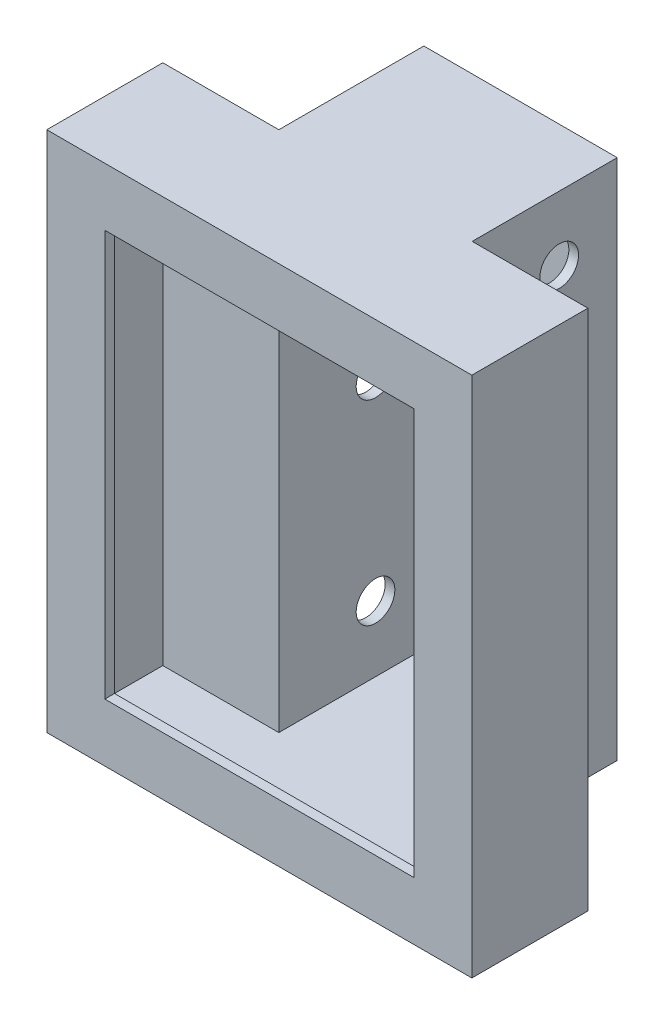
ISO-10303-21;
HEADER;
FILE_DESCRIPTION(('STEP AP214'),'2;1');
FILE_NAME('part.step','',(''),(''),'','','');
FILE_SCHEMA(('AUTOMOTIVE_DESIGN { 1 0 10303 214 1 1 1 1 }'));
ENDSEC;
DATA;
#1=APPLICATION_CONTEXT('core data for automotive mechanical design processes');
#2=APPLICATION_PROTOCOL_DEFINITION('international standard','automotive_design',2000,#1);
#3=PRODUCT_CONTEXT('',#1,'mechanical');
#4=PRODUCT('Part','Part','',(#3));
#5=PRODUCT_RELATED_PRODUCT_CATEGORY('part','',(#4));
#6=PRODUCT_DEFINITION_FORMATION('','',#4);
#7=PRODUCT_DEFINITION_CONTEXT('part definition',#1,'design');
#8=PRODUCT_DEFINITION('design','',#6,#7);
#9=PRODUCT_DEFINITION_SHAPE('','',#8);
#10=(LENGTH_UNIT() NAMED_UNIT(*) SI_UNIT(.MILLI.,.METRE.));
#11=(NAMED_UNIT(*) PLANE_ANGLE_UNIT() SI_UNIT($,.RADIAN.));
#12=(NAMED_UNIT(*) SI_UNIT($,.STERADIAN.) SOLID_ANGLE_UNIT());
#13=UNCERTAINTY_MEASURE_WITH_UNIT(LENGTH_MEASURE(1.E-05),#10,'distance_accuracy_value','');
#14=(GEOMETRIC_REPRESENTATION_CONTEXT(3) GLOBAL_UNCERTAINTY_ASSIGNED_CONTEXT((#13)) GLOBAL_UNIT_ASSIGNED_CONTEXT((#10,
#11,#12)) REPRESENTATION_CONTEXT('',''));
#15=CARTESIAN_POINT('',(0.,0.,0.));
#16=DIRECTION('',(0.,0.,1.));
#17=DIRECTION('',(1.,0.,0.));
#18=AXIS2_PLACEMENT_3D('',#15,#16,#17);
#19=CARTESIAN_POINT('',(0.,0.,5.));
#20=DIRECTION('',(-1.,0.,0.));
#21=DIRECTION('',(0.,0.,1.));
#22=AXIS2_PLACEMENT_3D('',#19,#20,#21);
#23=PLANE('',#22);
#24=CARTESIAN_POINT('',(0.,236.400600349484,30.));
#25=DIRECTION('',(-1.,0.,0.));
#26=DIRECTION('',(0.,0.,1.));
#27=AXIS2_PLACEMENT_3D('',#24,#25,#26);
#28=CIRCLE('',#27,10.);
#29=CARTESIAN_POINT('',(0.,236.400600349484,40.));
#30=VERTEX_POINT('',#29);
#31=EDGE_CURVE('E245',#30,#30,#28,.T.);
#32=ORIENTED_EDGE('',*,*,#31,.T.);
#33=EDGE_LOOP('',(#32));
#34=FACE_BOUND('',#33,.T.);
#35=CARTESIAN_POINT('',(0.,38.9759522837849,30.));
#36=DIRECTION('',(-1.,0.,0.));
#37=DIRECTION('',(0.,0.,1.));
#38=AXIS2_PLACEMENT_3D('',#35,#36,#37);
#39=CIRCLE('',#38,10.);
#40=CARTESIAN_POINT('',(0.,38.9759522837849,40.));
#41=VERTEX_POINT('',#40);
#42=EDGE_CURVE('E255',#41,#41,#39,.T.);
#43=ORIENTED_EDGE('',*,*,#42,.T.);
#44=EDGE_LOOP('',(#43));
#45=FACE_BOUND('',#44,.T.);
#46=CARTESIAN_POINT('',(0.,140.,30.));
#47=DIRECTION('',(-1.,0.,0.));
#48=DIRECTION('',(0.,0.,1.));
#49=AXIS2_PLACEMENT_3D('',#46,#47,#48);
#50=CIRCLE('',#49,10.);
#51=CARTESIAN_POINT('',(0.,140.,40.));
#52=VERTEX_POINT('',#51);
#53=EDGE_CURVE('E265',#52,#52,#50,.T.);
#54=ORIENTED_EDGE('',*,*,#53,.T.);
#55=EDGE_LOOP('',(#54));
#56=FACE_BOUND('',#55,.T.);
#57=DIRECTION('',(0.,1.,0.));
#58=VECTOR('',#57,1.);
#59=CARTESIAN_POINT('',(0.,0.,0.));
#60=LINE('',#59,#58);
#61=CARTESIAN_POINT('',(0.,0.,0.));
#62=VERTEX_POINT('',#61);
#63=CARTESIAN_POINT('',(0.,270.,0.));
#64=VERTEX_POINT('',#63);
#65=EDGE_CURVE('E404',#62,#64,#60,.T.);
#66=ORIENTED_EDGE('',*,*,#65,.T.);
#67=DIRECTION('',(0.,0.,-1.));
#68=VECTOR('',#67,1.);
#69=CARTESIAN_POINT('',(0.,270.,5.));
#70=LINE('',#69,#68);
#71=CARTESIAN_POINT('',(0.,270.,75.));
#72=VERTEX_POINT('',#71);
#73=EDGE_CURVE('E362',#72,#64,#70,.T.);
#74=ORIENTED_EDGE('',*,*,#73,.F.);
#75=DIRECTION('',(0.,1.,0.));
#76=VECTOR('',#75,1.);
#77=CARTESIAN_POINT('',(0.,270.,75.));
#78=LINE('',#77,#76);
#79=CARTESIAN_POINT('',(0.,0.,75.));
#80=VERTEX_POINT('',#79);
#81=EDGE_CURVE('E398',#80,#72,#78,.T.);
#82=ORIENTED_EDGE('',*,*,#81,.F.);
#83=DIRECTION('',(0.,0.,-1.));
#84=VECTOR('',#83,1.);
#85=CARTESIAN_POINT('',(0.,0.,5.));
#86=LINE('',#85,#84);
#87=EDGE_CURVE('E375',#80,#62,#86,.T.);
#88=ORIENTED_EDGE('',*,*,#87,.T.);
#89=EDGE_LOOP('',(#66,#74,#82,#88));
#90=FACE_BOUND('',#89,.T.);
#91=ADVANCED_FACE('F33',(#34,#45,#56,#90),#23,.F.);
#92=CARTESIAN_POINT('',(0.,270.,5.));
#93=DIRECTION('',(0.,-1.,0.));
#94=DIRECTION('',(0.,0.,-1.));
#95=AXIS2_PLACEMENT_3D('',#92,#93,#94);
#96=PLANE('',#95);
#97=DIRECTION('',(0.,0.,-1.));
#98=VECTOR('',#97,1.);
#99=CARTESIAN_POINT('',(-160.,270.,80.));
#100=LINE('',#99,#98);
#101=CARTESIAN_POINT('',(-160.,270.,135.));
#102=VERTEX_POINT('',#101);
#103=CARTESIAN_POINT('',(-160.,270.,75.));
#104=VERTEX_POINT('',#103);
#105=EDGE_CURVE('E344',#102,#104,#100,.T.);
#106=ORIENTED_EDGE('',*,*,#105,.F.);
#107=DIRECTION('',(-1.,0.,0.));
#108=VECTOR('',#107,1.);
#109=CARTESIAN_POINT('',(59.8318515374138,270.,135.));
#110=LINE('',#109,#108);
#111=CARTESIAN_POINT('',(59.8318515374138,270.,135.));
#112=VERTEX_POINT('',#111);
#113=EDGE_CURVE('E236',#112,#102,#110,.T.);
#114=ORIENTED_EDGE('',*,*,#113,.F.);
#115=DIRECTION('',(0.,0.,-1.));
#116=VECTOR('',#115,1.);
#117=CARTESIAN_POINT('',(59.8318515374138,270.,80.));
#118=LINE('',#117,#116);
#119=CARTESIAN_POINT('',(59.8318515374138,270.,75.));
#120=VERTEX_POINT('',#119);
#121=EDGE_CURVE('E440',#112,#120,#118,.T.);
#122=ORIENTED_EDGE('',*,*,#121,.T.);
#123=DIRECTION('',(-1.,0.,0.));
#124=VECTOR('',#123,1.);
#125=CARTESIAN_POINT('',(-5.16814846258618,270.,75.));
#126=LINE('',#125,#124);
#127=EDGE_CURVE('E442',#120,#72,#126,.T.);
#128=ORIENTED_EDGE('',*,*,#127,.T.);
#129=ORIENTED_EDGE('',*,*,#73,.T.);
#130=DIRECTION('',(-1.,0.,0.));
#131=VECTOR('',#130,1.);
#132=CARTESIAN_POINT('',(0.,270.,0.));
#133=LINE('',#132,#131);
#134=CARTESIAN_POINT('',(-100.,270.,0.));
#135=VERTEX_POINT('',#134);
#136=EDGE_CURVE('E406',#64,#135,#133,.T.);
#137=ORIENTED_EDGE('',*,*,#136,.T.);
#138=DIRECTION('',(0.,0.,-1.));
#139=VECTOR('',#138,1.);
#140=CARTESIAN_POINT('',(-100.,270.,5.));
#141=LINE('',#140,#139);
#142=CARTESIAN_POINT('',(-100.,270.,75.));
#143=VERTEX_POINT('',#142);
#144=EDGE_CURVE('E365',#143,#135,#141,.T.);
#145=ORIENTED_EDGE('',*,*,#144,.F.);
#146=DIRECTION('',(-1.,0.,0.));
#147=VECTOR('',#146,1.);
#148=CARTESIAN_POINT('',(-95.,270.,75.));
#149=LINE('',#148,#147);
#150=EDGE_CURVE('E345',#143,#104,#149,.T.);
#151=ORIENTED_EDGE('',*,*,#150,.T.);
#152=EDGE_LOOP('',(#106,#114,#122,#128,#129,#137,#145,#151));
#153=FACE_BOUND('',#152,.T.);
#154=ADVANCED_FACE('F420',(#153),#96,.F.);
#155=CARTESIAN_POINT('',(-100.,0.,5.));
#156=DIRECTION('',(1.,0.,0.));
#157=DIRECTION('',(0.,0.,-1.));
#158=AXIS2_PLACEMENT_3D('',#155,#156,#157);
#159=PLANE('',#158);
#160=CARTESIAN_POINT('',(-100.,236.400600349484,30.));
#161=DIRECTION('',(-1.,0.,0.));
#162=DIRECTION('',(0.,0.,1.));
#163=AXIS2_PLACEMENT_3D('',#160,#161,#162);
#164=CIRCLE('',#163,10.);
#165=CARTESIAN_POINT('',(-100.,236.400600349484,40.));
#166=VERTEX_POINT('',#165);
#167=EDGE_CURVE('E239',#166,#166,#164,.T.);
#168=ORIENTED_EDGE('',*,*,#167,.F.);
#169=EDGE_LOOP('',(#168));
#170=FACE_BOUND('',#169,.T.);
#171=CARTESIAN_POINT('',(-100.,38.9759522837849,30.));
#172=DIRECTION('',(-1.,0.,0.));
#173=DIRECTION('',(0.,0.,1.));
#174=AXIS2_PLACEMENT_3D('',#171,#172,#173);
#175=CIRCLE('',#174,10.);
#176=CARTESIAN_POINT('',(-100.,38.9759522837849,40.));
#177=VERTEX_POINT('',#176);
#178=EDGE_CURVE('E248',#177,#177,#175,.T.);
#179=ORIENTED_EDGE('',*,*,#178,.F.);
#180=EDGE_LOOP('',(#179));
#181=FACE_BOUND('',#180,.T.);
#182=CARTESIAN_POINT('',(-100.,140.,30.));
#183=DIRECTION('',(-1.,0.,0.));
#184=DIRECTION('',(0.,0.,1.));
#185=AXIS2_PLACEMENT_3D('',#182,#183,#184);
#186=CIRCLE('',#185,10.);
#187=CARTESIAN_POINT('',(-100.,140.,40.));
#188=VERTEX_POINT('',#187);
#189=EDGE_CURVE('E258',#188,#188,#186,.T.);
#190=ORIENTED_EDGE('',*,*,#189,.F.);
#191=EDGE_LOOP('',(#190));
#192=FACE_BOUND('',#191,.T.);
#193=DIRECTION('',(0.,-1.,0.));
#194=VECTOR('',#193,1.);
#195=CARTESIAN_POINT('',(-100.,0.,0.));
#196=LINE('',#195,#194);
#197=CARTESIAN_POINT('',(-100.,0.,0.));
#198=VERTEX_POINT('',#197);
#199=EDGE_CURVE('E408',#135,#198,#196,.T.);
#200=ORIENTED_EDGE('',*,*,#199,.T.);
#201=DIRECTION('',(0.,0.,-1.));
#202=VECTOR('',#201,1.);
#203=CARTESIAN_POINT('',(-100.,0.,5.));
#204=LINE('',#203,#202);
#205=CARTESIAN_POINT('',(-100.,0.,75.));
#206=VERTEX_POINT('',#205);
#207=EDGE_CURVE('E372',#206,#198,#204,.T.);
#208=ORIENTED_EDGE('',*,*,#207,.F.);
#209=DIRECTION('',(0.,-1.,0.));
#210=VECTOR('',#209,1.);
#211=CARTESIAN_POINT('',(-100.,270.,75.));
#212=LINE('',#211,#210);
#213=EDGE_CURVE('E385',#143,#206,#212,.T.);
#214=ORIENTED_EDGE('',*,*,#213,.F.);
#215=ORIENTED_EDGE('',*,*,#144,.T.);
#216=EDGE_LOOP('',(#200,#208,#214,#215));
#217=FACE_BOUND('',#216,.T.);
#218=ADVANCED_FACE('F423',(#170,#181,#192,#217),#159,.F.);
#219=CARTESIAN_POINT('',(0.,0.,5.));
#220=DIRECTION('',(0.,1.,0.));
#221=DIRECTION('',(-1.,0.,0.));
#222=AXIS2_PLACEMENT_3D('',#219,#220,#221);
#223=PLANE('',#222);
#224=DIRECTION('',(1.,0.,0.));
#225=VECTOR('',#224,1.);
#226=CARTESIAN_POINT('',(0.,0.,0.));
#227=LINE('',#226,#225);
#228=EDGE_CURVE('E409',#198,#62,#227,.T.);
#229=ORIENTED_EDGE('',*,*,#228,.T.);
#230=ORIENTED_EDGE('',*,*,#87,.F.);
#231=DIRECTION('',(1.,0.,0.));
#232=VECTOR('',#231,1.);
#233=CARTESIAN_POINT('',(-5.16814846258618,0.,75.));
#234=LINE('',#233,#232);
#235=CARTESIAN_POINT('',(59.8318515374138,0.,75.));
#236=VERTEX_POINT('',#235);
#237=EDGE_CURVE('E358',#80,#236,#234,.T.);
#238=ORIENTED_EDGE('',*,*,#237,.T.);
#239=DIRECTION('',(0.,0.,-1.));
#240=VECTOR('',#239,1.);
#241=CARTESIAN_POINT('',(59.8318515374138,0.,80.));
#242=LINE('',#241,#240);
#243=CARTESIAN_POINT('',(59.8318515374138,0.,135.));
#244=VERTEX_POINT('',#243);
#245=EDGE_CURVE('E357',#244,#236,#242,.T.);
#246=ORIENTED_EDGE('',*,*,#245,.F.);
#247=DIRECTION('',(1.,0.,0.));
#248=VECTOR('',#247,1.);
#249=CARTESIAN_POINT('',(-160.,0.,135.));
#250=LINE('',#249,#248);
#251=CARTESIAN_POINT('',(-160.,0.,135.));
#252=VERTEX_POINT('',#251);
#253=EDGE_CURVE('E230',#252,#244,#250,.T.);
#254=ORIENTED_EDGE('',*,*,#253,.F.);
#255=DIRECTION('',(0.,0.,-1.));
#256=VECTOR('',#255,1.);
#257=CARTESIAN_POINT('',(-160.,0.,80.));
#258=LINE('',#257,#256);
#259=CARTESIAN_POINT('',(-160.,0.,75.));
#260=VERTEX_POINT('',#259);
#261=EDGE_CURVE('E347',#252,#260,#258,.T.);
#262=ORIENTED_EDGE('',*,*,#261,.T.);
#263=DIRECTION('',(1.,0.,0.));
#264=VECTOR('',#263,1.);
#265=CARTESIAN_POINT('',(-95.,0.,75.));
#266=LINE('',#265,#264);
#267=EDGE_CURVE('E349',#260,#206,#266,.T.);
#268=ORIENTED_EDGE('',*,*,#267,.T.);
#269=ORIENTED_EDGE('',*,*,#207,.T.);
#270=EDGE_LOOP('',(#229,#230,#238,#246,#254,#262,#268,#269));
#271=FACE_BOUND('',#270,.T.);
#272=ADVANCED_FACE('F564',(#271),#223,.F.);
#273=CARTESIAN_POINT('',(0.,0.,0.));
#274=DIRECTION('',(0.,0.,1.));
#275=DIRECTION('',(1.,0.,0.));
#276=AXIS2_PLACEMENT_3D('',#273,#274,#275);
#277=PLANE('',#276);
#278=ORIENTED_EDGE('',*,*,#65,.F.);
#279=ORIENTED_EDGE('',*,*,#228,.F.);
#280=ORIENTED_EDGE('',*,*,#199,.F.);
#281=ORIENTED_EDGE('',*,*,#136,.F.);
#282=EDGE_LOOP('',(#278,#279,#280,#281));
#283=FACE_BOUND('',#282,.T.);
#284=ADVANCED_FACE('F418',(#283),#277,.F.);
#285=CARTESIAN_POINT('',(-160.,270.,80.));
#286=DIRECTION('',(1.,0.,0.));
#287=DIRECTION('',(0.,1.,0.));
#288=AXIS2_PLACEMENT_3D('',#285,#286,#287);
#289=PLANE('',#288);
#290=DIRECTION('',(0.,-1.,0.));
#291=VECTOR('',#290,1.);
#292=CARTESIAN_POINT('',(-160.,270.,75.));
#293=LINE('',#292,#291);
#294=EDGE_CURVE('E430',#104,#260,#293,.T.);
#295=ORIENTED_EDGE('',*,*,#294,.T.);
#296=ORIENTED_EDGE('',*,*,#261,.F.);
#297=DIRECTION('',(0.,-1.,0.));
#298=VECTOR('',#297,1.);
#299=CARTESIAN_POINT('',(-160.,270.,135.));
#300=LINE('',#299,#298);
#301=EDGE_CURVE('E204',#102,#252,#300,.T.);
#302=ORIENTED_EDGE('',*,*,#301,.F.);
#303=ORIENTED_EDGE('',*,*,#105,.T.);
#304=EDGE_LOOP('',(#295,#296,#302,#303));
#305=FACE_BOUND('',#304,.T.);
#306=ADVANCED_FACE('F434',(#305),#289,.F.);
#307=CARTESIAN_POINT('',(0.,0.,75.));
#308=DIRECTION('',(0.,0.,-1.));
#309=DIRECTION('',(-1.,0.,0.));
#310=AXIS2_PLACEMENT_3D('',#307,#308,#309);
#311=PLANE('',#310);
#312=ORIENTED_EDGE('',*,*,#150,.F.);
#313=ORIENTED_EDGE('',*,*,#213,.T.);
#314=ORIENTED_EDGE('',*,*,#267,.F.);
#315=ORIENTED_EDGE('',*,*,#294,.F.);
#316=EDGE_LOOP('',(#312,#313,#314,#315));
#317=FACE_BOUND('',#316,.T.);
#318=ADVANCED_FACE('F428',(#317),#311,.T.);
#319=CARTESIAN_POINT('',(0.,0.,75.));
#320=DIRECTION('',(0.,0.,1.));
#321=DIRECTION('',(1.,0.,0.));
#322=AXIS2_PLACEMENT_3D('',#319,#320,#321);
#323=PLANE('',#322);
#324=ORIENTED_EDGE('',*,*,#237,.F.);
#325=ORIENTED_EDGE('',*,*,#81,.T.);
#326=ORIENTED_EDGE('',*,*,#127,.F.);
#327=DIRECTION('',(0.,1.,0.));
#328=VECTOR('',#327,1.);
#329=CARTESIAN_POINT('',(59.8318515374138,270.,75.));
#330=LINE('',#329,#328);
#331=EDGE_CURVE('E314',#236,#120,#330,.T.);
#332=ORIENTED_EDGE('',*,*,#331,.F.);
#333=EDGE_LOOP('',(#324,#325,#326,#332));
#334=FACE_BOUND('',#333,.T.);
#335=ADVANCED_FACE('F506',(#334),#323,.F.);
#336=CARTESIAN_POINT('',(59.8318515374138,270.,80.));
#337=DIRECTION('',(-1.,0.,0.));
#338=DIRECTION('',(0.,-1.,0.));
#339=AXIS2_PLACEMENT_3D('',#336,#337,#338);
#340=PLANE('',#339);
#341=ORIENTED_EDGE('',*,*,#331,.T.);
#342=ORIENTED_EDGE('',*,*,#121,.F.);
#343=DIRECTION('',(0.,1.,0.));
#344=VECTOR('',#343,1.);
#345=CARTESIAN_POINT('',(59.8318515374138,240.,135.));
#346=LINE('',#345,#344);
#347=EDGE_CURVE('E233',#244,#112,#346,.T.);
#348=ORIENTED_EDGE('',*,*,#347,.F.);
#349=ORIENTED_EDGE('',*,*,#245,.T.);
#350=EDGE_LOOP('',(#341,#342,#348,#349));
#351=FACE_BOUND('',#350,.T.);
#352=ADVANCED_FACE('F448',(#351),#340,.F.);
#353=CARTESIAN_POINT('',(-155.,265.,130.));
#354=DIRECTION('',(1.,0.,0.));
#355=DIRECTION('',(0.,0.,-1.));
#356=AXIS2_PLACEMENT_3D('',#353,#354,#355);
#357=PLANE('',#356);
#358=DIRECTION('',(0.,-1.,0.));
#359=VECTOR('',#358,1.);
#360=CARTESIAN_POINT('',(-155.,265.,80.));
#361=LINE('',#360,#359);
#362=CARTESIAN_POINT('',(-155.,265.,80.));
#363=VERTEX_POINT('',#362);
#364=CARTESIAN_POINT('',(-155.,5.,80.));
#365=VERTEX_POINT('',#364);
#366=EDGE_CURVE('E281',#363,#365,#361,.T.);
#367=ORIENTED_EDGE('',*,*,#366,.F.);
#368=DIRECTION('',(0.,0.,-1.));
#369=VECTOR('',#368,1.);
#370=CARTESIAN_POINT('',(-155.,265.,130.));
#371=LINE('',#370,#369);
#372=CARTESIAN_POINT('',(-155.,265.,130.));
#373=VERTEX_POINT('',#372);
#374=EDGE_CURVE('E292',#373,#363,#371,.T.);
#375=ORIENTED_EDGE('',*,*,#374,.F.);
#376=DIRECTION('',(0.,-1.,0.));
#377=VECTOR('',#376,1.);
#378=CARTESIAN_POINT('',(-155.,265.,130.));
#379=LINE('',#378,#377);
#380=CARTESIAN_POINT('',(-155.,5.,130.));
#381=VERTEX_POINT('',#380);
#382=EDGE_CURVE('E272',#373,#381,#379,.T.);
#383=ORIENTED_EDGE('',*,*,#382,.T.);
#384=DIRECTION('',(0.,0.,-1.));
#385=VECTOR('',#384,1.);
#386=CARTESIAN_POINT('',(-155.,5.,130.));
#387=LINE('',#386,#385);
#388=EDGE_CURVE('E290',#381,#365,#387,.T.);
#389=ORIENTED_EDGE('',*,*,#388,.T.);
#390=EDGE_LOOP('',(#367,#375,#383,#389));
#391=FACE_BOUND('',#390,.T.);
#392=ADVANCED_FACE('F489',(#391),#357,.T.);
#393=CARTESIAN_POINT('',(54.8318515374138,265.,130.));
#394=DIRECTION('',(-1.,0.,0.));
#395=DIRECTION('',(0.,-1.,0.));
#396=AXIS2_PLACEMENT_3D('',#393,#394,#395);
#397=PLANE('',#396);
#398=DIRECTION('',(0.,1.,0.));
#399=VECTOR('',#398,1.);
#400=CARTESIAN_POINT('',(54.8318515374138,265.,80.));
#401=LINE('',#400,#399);
#402=CARTESIAN_POINT('',(54.8318515374138,5.,80.));
#403=VERTEX_POINT('',#402);
#404=CARTESIAN_POINT('',(54.8318515374138,265.,80.));
#405=VERTEX_POINT('',#404);
#406=EDGE_CURVE('E273',#403,#405,#401,.T.);
#407=ORIENTED_EDGE('',*,*,#406,.F.);
#408=DIRECTION('',(0.,0.,-1.));
#409=VECTOR('',#408,1.);
#410=CARTESIAN_POINT('',(54.8318515374138,5.,130.));
#411=LINE('',#410,#409);
#412=CARTESIAN_POINT('',(54.8318515374138,5.,130.));
#413=VERTEX_POINT('',#412);
#414=EDGE_CURVE('E288',#413,#403,#411,.T.);
#415=ORIENTED_EDGE('',*,*,#414,.F.);
#416=DIRECTION('',(0.,1.,0.));
#417=VECTOR('',#416,1.);
#418=CARTESIAN_POINT('',(54.8318515374138,265.,130.));
#419=LINE('',#418,#417);
#420=CARTESIAN_POINT('',(54.8318515374138,265.,130.));
#421=VERTEX_POINT('',#420);
#422=EDGE_CURVE('E279',#413,#421,#419,.T.);
#423=ORIENTED_EDGE('',*,*,#422,.T.);
#424=DIRECTION('',(0.,0.,-1.));
#425=VECTOR('',#424,1.);
#426=CARTESIAN_POINT('',(54.8318515374138,265.,130.));
#427=LINE('',#426,#425);
#428=EDGE_CURVE('E49',#421,#405,#427,.T.);
#429=ORIENTED_EDGE('',*,*,#428,.T.);
#430=EDGE_LOOP('',(#407,#415,#423,#429));
#431=FACE_BOUND('',#430,.T.);
#432=ADVANCED_FACE('F495',(#431),#397,.T.);
#433=CARTESIAN_POINT('',(-5.,265.,75.));
#434=DIRECTION('',(-1.,0.,0.));
#435=DIRECTION('',(0.,-1.,0.));
#436=AXIS2_PLACEMENT_3D('',#433,#434,#435);
#437=PLANE('',#436);
#438=CARTESIAN_POINT('',(-5.,236.400600349484,30.));
#439=DIRECTION('',(-1.,0.,0.));
#440=DIRECTION('',(0.,-1.,0.));
#441=AXIS2_PLACEMENT_3D('',#438,#439,#440);
#442=CIRCLE('',#441,10.);
#443=CARTESIAN_POINT('',(-5.,226.400600349484,30.));
#444=VERTEX_POINT('',#443);
#445=EDGE_CURVE('E242',#444,#444,#442,.T.);
#446=ORIENTED_EDGE('',*,*,#445,.F.);
#447=EDGE_LOOP('',(#446));
#448=FACE_BOUND('',#447,.T.);
#449=CARTESIAN_POINT('',(-5.,38.9759522837849,30.));
#450=DIRECTION('',(-1.,0.,0.));
#451=DIRECTION('',(0.,-1.,0.));
#452=AXIS2_PLACEMENT_3D('',#449,#450,#451);
#453=CIRCLE('',#452,10.);
#454=CARTESIAN_POINT('',(-5.,28.9759522837849,30.));
#455=VERTEX_POINT('',#454);
#456=EDGE_CURVE('E252',#455,#455,#453,.T.);
#457=ORIENTED_EDGE('',*,*,#456,.F.);
#458=EDGE_LOOP('',(#457));
#459=FACE_BOUND('',#458,.T.);
#460=CARTESIAN_POINT('',(-5.,140.,30.));
#461=DIRECTION('',(-1.,0.,0.));
#462=DIRECTION('',(0.,-1.,0.));
#463=AXIS2_PLACEMENT_3D('',#460,#461,#462);
#464=CIRCLE('',#463,10.);
#465=CARTESIAN_POINT('',(-5.,130.,30.));
#466=VERTEX_POINT('',#465);
#467=EDGE_CURVE('E262',#466,#466,#464,.T.);
#468=ORIENTED_EDGE('',*,*,#467,.F.);
#469=EDGE_LOOP('',(#468));
#470=FACE_BOUND('',#469,.T.);
#471=DIRECTION('',(0.,1.,0.));
#472=VECTOR('',#471,1.);
#473=CARTESIAN_POINT('',(-5.,265.,5.));
#474=LINE('',#473,#472);
#475=CARTESIAN_POINT('',(-5.,5.,5.));
#476=VERTEX_POINT('',#475);
#477=CARTESIAN_POINT('',(-5.,265.,5.));
#478=VERTEX_POINT('',#477);
#479=EDGE_CURVE('E381',#476,#478,#474,.T.);
#480=ORIENTED_EDGE('',*,*,#479,.F.);
#481=DIRECTION('',(0.,0.,-1.));
#482=VECTOR('',#481,1.);
#483=CARTESIAN_POINT('',(-5.,5.,75.));
#484=LINE('',#483,#482);
#485=CARTESIAN_POINT('',(-5.,5.,75.));
#486=VERTEX_POINT('',#485);
#487=EDGE_CURVE('E389',#486,#476,#484,.T.);
#488=ORIENTED_EDGE('',*,*,#487,.F.);
#489=DIRECTION('',(0.,1.,0.));
#490=VECTOR('',#489,1.);
#491=CARTESIAN_POINT('',(-5.,265.,75.));
#492=LINE('',#491,#490);
#493=CARTESIAN_POINT('',(-5.,265.,75.));
#494=VERTEX_POINT('',#493);
#495=EDGE_CURVE('E380',#486,#494,#492,.T.);
#496=ORIENTED_EDGE('',*,*,#495,.T.);
#497=DIRECTION('',(0.,0.,-1.));
#498=VECTOR('',#497,1.);
#499=CARTESIAN_POINT('',(-5.,265.,75.));
#500=LINE('',#499,#498);
#501=EDGE_CURVE('E468',#494,#478,#500,.T.);
#502=ORIENTED_EDGE('',*,*,#501,.T.);
#503=EDGE_LOOP('',(#480,#488,#496,#502));
#504=FACE_BOUND('',#503,.T.);
#505=ADVANCED_FACE('F483',(#448,#459,#470,#504),#437,.T.);
#506=DIRECTION('',(-1.,0.,0.));
#507=VECTOR('',#506,1.);
#508=CARTESIAN_POINT('',(-95.,265.,75.));
#509=LINE('',#508,#507);
#510=CARTESIAN_POINT('',(-5.1681484625862,265.,75.));
#511=VERTEX_POINT('',#510);
#512=EDGE_CURVE('E377',#494,#511,#509,.T.);
#513=ORIENTED_EDGE('',*,*,#512,.F.);
#514=ORIENTED_EDGE('',*,*,#495,.F.);
#515=DIRECTION('',(1.,0.,0.));
#516=VECTOR('',#515,1.);
#517=CARTESIAN_POINT('',(-95.,5.,75.));
#518=LINE('',#517,#516);
#519=CARTESIAN_POINT('',(-5.16814846258618,5.,75.));
#520=VERTEX_POINT('',#519);
#521=EDGE_CURVE('E444',#520,#486,#518,.T.);
#522=ORIENTED_EDGE('',*,*,#521,.F.);
#523=DIRECTION('',(0.,-1.,0.));
#524=VECTOR('',#523,1.);
#525=CARTESIAN_POINT('',(-5.16814846258618,270.,75.));
#526=LINE('',#525,#524);
#527=EDGE_CURVE('E450',#511,#520,#526,.T.);
#528=ORIENTED_EDGE('',*,*,#527,.F.);
#529=EDGE_LOOP('',(#513,#514,#522,#528));
#530=FACE_BOUND('',#529,.T.);
#531=ADVANCED_FACE('F503',(#530),#323,.F.);
#532=CARTESIAN_POINT('',(0.,0.,80.));
#533=DIRECTION('',(0.,0.,-1.));
#534=DIRECTION('',(-1.,0.,0.));
#535=AXIS2_PLACEMENT_3D('',#532,#533,#534);
#536=PLANE('',#535);
#537=DIRECTION('',(0.,1.,0.));
#538=VECTOR('',#537,1.);
#539=CARTESIAN_POINT('',(-95.,270.,80.));
#540=LINE('',#539,#538);
#541=CARTESIAN_POINT('',(-95.,5.,80.));
#542=VERTEX_POINT('',#541);
#543=CARTESIAN_POINT('',(-95.,265.,80.));
#544=VERTEX_POINT('',#543);
#545=EDGE_CURVE('E337',#542,#544,#540,.T.);
#546=ORIENTED_EDGE('',*,*,#545,.T.);
#547=DIRECTION('',(-1.,0.,0.));
#548=VECTOR('',#547,1.);
#549=CARTESIAN_POINT('',(-155.,265.,80.));
#550=LINE('',#549,#548);
#551=EDGE_CURVE('E11',#544,#363,#550,.T.);
#552=ORIENTED_EDGE('',*,*,#551,.T.);
#553=ORIENTED_EDGE('',*,*,#366,.T.);
#554=DIRECTION('',(1.,0.,0.));
#555=VECTOR('',#554,1.);
#556=CARTESIAN_POINT('',(-155.,5.,80.));
#557=LINE('',#556,#555);
#558=EDGE_CURVE('E284',#365,#542,#557,.T.);
#559=ORIENTED_EDGE('',*,*,#558,.T.);
#560=EDGE_LOOP('',(#546,#552,#553,#559));
#561=FACE_BOUND('',#560,.T.);
#562=ADVANCED_FACE('F328',(#561),#536,.F.);
#563=CARTESIAN_POINT('',(-95.,265.,75.));
#564=DIRECTION('',(1.,0.,0.));
#565=DIRECTION('',(0.,0.,-1.));
#566=AXIS2_PLACEMENT_3D('',#563,#564,#565);
#567=PLANE('',#566);
#568=CARTESIAN_POINT('',(-95.,236.400600349484,30.));
#569=DIRECTION('',(1.,0.,0.));
#570=DIRECTION('',(0.,0.,-1.));
#571=AXIS2_PLACEMENT_3D('',#568,#569,#570);
#572=CIRCLE('',#571,10.);
#573=CARTESIAN_POINT('',(-95.,236.400600349484,20.));
#574=VERTEX_POINT('',#573);
#575=EDGE_CURVE('E36',#574,#574,#572,.T.);
#576=ORIENTED_EDGE('',*,*,#575,.F.);
#577=EDGE_LOOP('',(#576));
#578=FACE_BOUND('',#577,.T.);
#579=CARTESIAN_POINT('',(-95.,38.9759522837849,30.));
#580=DIRECTION('',(1.,0.,0.));
#581=DIRECTION('',(0.,0.,-1.));
#582=AXIS2_PLACEMENT_3D('',#579,#580,#581);
#583=CIRCLE('',#582,10.);
#584=CARTESIAN_POINT('',(-95.,38.9759522837849,20.));
#585=VERTEX_POINT('',#584);
#586=EDGE_CURVE('E251',#585,#585,#583,.T.);
#587=ORIENTED_EDGE('',*,*,#586,.F.);
#588=EDGE_LOOP('',(#587));
#589=FACE_BOUND('',#588,.T.);
#590=CARTESIAN_POINT('',(-95.,140.,30.));
#591=DIRECTION('',(1.,0.,0.));
#592=DIRECTION('',(0.,0.,-1.));
#593=AXIS2_PLACEMENT_3D('',#590,#591,#592);
#594=CIRCLE('',#593,10.);
#595=CARTESIAN_POINT('',(-95.,140.,20.));
#596=VERTEX_POINT('',#595);
#597=EDGE_CURVE('E261',#596,#596,#594,.T.);
#598=ORIENTED_EDGE('',*,*,#597,.F.);
#599=EDGE_LOOP('',(#598));
#600=FACE_BOUND('',#599,.T.);
#601=ORIENTED_EDGE('',*,*,#545,.F.);
#602=DIRECTION('',(0.,0.,-1.));
#603=VECTOR('',#602,1.);
#604=CARTESIAN_POINT('',(-95.,5.,75.));
#605=LINE('',#604,#603);
#606=CARTESIAN_POINT('',(-95.,5.,5.));
#607=VERTEX_POINT('',#606);
#608=EDGE_CURVE('E339',#542,#607,#605,.T.);
#609=ORIENTED_EDGE('',*,*,#608,.T.);
#610=DIRECTION('',(0.,-1.,0.));
#611=VECTOR('',#610,1.);
#612=CARTESIAN_POINT('',(-95.,265.,5.));
#613=LINE('',#612,#611);
#614=CARTESIAN_POINT('',(-95.,265.,5.));
#615=VERTEX_POINT('',#614);
#616=EDGE_CURVE('E470',#615,#607,#613,.T.);
#617=ORIENTED_EDGE('',*,*,#616,.F.);
#618=DIRECTION('',(0.,0.,-1.));
#619=VECTOR('',#618,1.);
#620=CARTESIAN_POINT('',(-95.,265.,75.));
#621=LINE('',#620,#619);
#622=EDGE_CURVE('E342',#544,#615,#621,.T.);
#623=ORIENTED_EDGE('',*,*,#622,.F.);
#624=EDGE_LOOP('',(#601,#609,#617,#623));
#625=FACE_BOUND('',#624,.T.);
#626=ADVANCED_FACE('F324',(#578,#589,#600,#625),#567,.T.);
#627=CARTESIAN_POINT('',(0.,0.,5.));
#628=DIRECTION('',(0.,0.,1.));
#629=DIRECTION('',(1.,0.,0.));
#630=AXIS2_PLACEMENT_3D('',#627,#628,#629);
#631=PLANE('',#630);
#632=DIRECTION('',(-1.,0.,0.));
#633=VECTOR('',#632,1.);
#634=CARTESIAN_POINT('',(-95.,265.,5.));
#635=LINE('',#634,#633);
#636=EDGE_CURVE('E57',#478,#615,#635,.T.);
#637=ORIENTED_EDGE('',*,*,#636,.T.);
#638=ORIENTED_EDGE('',*,*,#616,.T.);
#639=DIRECTION('',(1.,0.,0.));
#640=VECTOR('',#639,1.);
#641=CARTESIAN_POINT('',(-95.,5.,5.));
#642=LINE('',#641,#640);
#643=EDGE_CURVE('E472',#607,#476,#642,.T.);
#644=ORIENTED_EDGE('',*,*,#643,.T.);
#645=ORIENTED_EDGE('',*,*,#479,.T.);
#646=EDGE_LOOP('',(#637,#638,#644,#645));
#647=FACE_BOUND('',#646,.T.);
#648=ADVANCED_FACE('F327',(#647),#631,.T.);
#649=CARTESIAN_POINT('',(-95.,265.,75.));
#650=DIRECTION('',(0.,-1.,0.));
#651=DIRECTION('',(0.,0.,-1.));
#652=AXIS2_PLACEMENT_3D('',#649,#650,#651);
#653=PLANE('',#652);
#654=ORIENTED_EDGE('',*,*,#636,.F.);
#655=ORIENTED_EDGE('',*,*,#501,.F.);
#656=ORIENTED_EDGE('',*,*,#512,.T.);
#657=DIRECTION('',(0.,0.,1.));
#658=VECTOR('',#657,1.);
#659=CARTESIAN_POINT('',(-5.16814846258618,265.,80.));
#660=LINE('',#659,#658);
#661=CARTESIAN_POINT('',(-5.16814846258634,265.,80.));
#662=VERTEX_POINT('',#661);
#663=EDGE_CURVE('E311',#511,#662,#660,.T.);
#664=ORIENTED_EDGE('',*,*,#663,.T.);
#665=EDGE_CURVE('E268',#405,#662,#550,.T.);
#666=ORIENTED_EDGE('',*,*,#665,.F.);
#667=ORIENTED_EDGE('',*,*,#428,.F.);
#668=DIRECTION('',(-1.,0.,0.));
#669=VECTOR('',#668,1.);
#670=CARTESIAN_POINT('',(-155.,265.,130.));
#671=LINE('',#670,#669);
#672=EDGE_CURVE('E269',#421,#373,#671,.T.);
#673=ORIENTED_EDGE('',*,*,#672,.T.);
#674=ORIENTED_EDGE('',*,*,#374,.T.);
#675=ORIENTED_EDGE('',*,*,#551,.F.);
#676=ORIENTED_EDGE('',*,*,#622,.T.);
#677=EDGE_LOOP('',(#654,#655,#656,#664,#666,#667,#673,#674,#675,#676));
#678=FACE_BOUND('',#677,.T.);
#679=ADVANCED_FACE('F485',(#678),#653,.T.);
#680=CARTESIAN_POINT('',(-95.,5.,75.));
#681=DIRECTION('',(0.,1.,0.));
#682=DIRECTION('',(-1.,0.,0.));
#683=AXIS2_PLACEMENT_3D('',#680,#681,#682);
#684=PLANE('',#683);
#685=ORIENTED_EDGE('',*,*,#643,.F.);
#686=ORIENTED_EDGE('',*,*,#608,.F.);
#687=ORIENTED_EDGE('',*,*,#558,.F.);
#688=ORIENTED_EDGE('',*,*,#388,.F.);
#689=DIRECTION('',(1.,0.,0.));
#690=VECTOR('',#689,1.);
#691=CARTESIAN_POINT('',(-155.,5.,130.));
#692=LINE('',#691,#690);
#693=EDGE_CURVE('E276',#381,#413,#692,.T.);
#694=ORIENTED_EDGE('',*,*,#693,.T.);
#695=ORIENTED_EDGE('',*,*,#414,.T.);
#696=CARTESIAN_POINT('',(-5.16814846258634,5.,80.));
#697=VERTEX_POINT('',#696);
#698=EDGE_CURVE('E41',#697,#403,#557,.T.);
#699=ORIENTED_EDGE('',*,*,#698,.F.);
#700=DIRECTION('',(0.,0.,-1.));
#701=VECTOR('',#700,1.);
#702=CARTESIAN_POINT('',(-5.16814846258618,5.,80.));
#703=LINE('',#702,#701);
#704=EDGE_CURVE('E295',#697,#520,#703,.T.);
#705=ORIENTED_EDGE('',*,*,#704,.T.);
#706=ORIENTED_EDGE('',*,*,#521,.T.);
#707=ORIENTED_EDGE('',*,*,#487,.T.);
#708=EDGE_LOOP('',(#685,#686,#687,#688,#694,#695,#699,#705,#706,#707));
#709=FACE_BOUND('',#708,.T.);
#710=ADVANCED_FACE('F481',(#709),#684,.T.);
#711=CARTESIAN_POINT('',(-5.16814846258618,270.,80.));
#712=DIRECTION('',(1.,0.,0.));
#713=DIRECTION('',(0.,0.,-1.));
#714=AXIS2_PLACEMENT_3D('',#711,#712,#713);
#715=PLANE('',#714);
#716=ORIENTED_EDGE('',*,*,#704,.F.);
#717=DIRECTION('',(0.,-1.,0.));
#718=VECTOR('',#717,1.);
#719=CARTESIAN_POINT('',(-5.16814846258618,270.,80.));
#720=LINE('',#719,#718);
#721=EDGE_CURVE('E354',#662,#697,#720,.T.);
#722=ORIENTED_EDGE('',*,*,#721,.F.);
#723=ORIENTED_EDGE('',*,*,#663,.F.);
#724=ORIENTED_EDGE('',*,*,#527,.T.);
#725=EDGE_LOOP('',(#716,#722,#723,#724));
#726=FACE_BOUND('',#725,.T.);
#727=ADVANCED_FACE('F501',(#726),#715,.F.);
#728=ORIENTED_EDGE('',*,*,#406,.T.);
#729=ORIENTED_EDGE('',*,*,#665,.T.);
#730=ORIENTED_EDGE('',*,*,#721,.T.);
#731=ORIENTED_EDGE('',*,*,#698,.T.);
#732=EDGE_LOOP('',(#728,#729,#730,#731));
#733=FACE_BOUND('',#732,.T.);
#734=ADVANCED_FACE('F496',(#733),#536,.F.);
#735=CARTESIAN_POINT('',(59.8318515374138,140.,30.));
#736=DIRECTION('',(-1.,0.,0.));
#737=DIRECTION('',(0.,0.,1.));
#738=AXIS2_PLACEMENT_3D('',#735,#736,#737);
#739=CYLINDRICAL_SURFACE('',#738,10.);
#740=ORIENTED_EDGE('',*,*,#597,.T.);
#741=EDGE_LOOP('',(#740));
#742=FACE_BOUND('',#741,.T.);
#743=ORIENTED_EDGE('',*,*,#189,.T.);
#744=EDGE_LOOP('',(#743));
#745=FACE_BOUND('',#744,.T.);
#746=ADVANCED_FACE('F530',(#742,#745),#739,.F.);
#747=ORIENTED_EDGE('',*,*,#467,.T.);
#748=EDGE_LOOP('',(#747));
#749=FACE_BOUND('',#748,.T.);
#750=ORIENTED_EDGE('',*,*,#53,.F.);
#751=EDGE_LOOP('',(#750));
#752=FACE_BOUND('',#751,.T.);
#753=ADVANCED_FACE('F528',(#749,#752),#739,.F.);
#754=CARTESIAN_POINT('',(59.8318515374138,38.9759522837849,30.));
#755=DIRECTION('',(-1.,0.,0.));
#756=DIRECTION('',(0.,0.,1.));
#757=AXIS2_PLACEMENT_3D('',#754,#755,#756);
#758=CYLINDRICAL_SURFACE('',#757,10.);
#759=ORIENTED_EDGE('',*,*,#586,.T.);
#760=EDGE_LOOP('',(#759));
#761=FACE_BOUND('',#760,.T.);
#762=ORIENTED_EDGE('',*,*,#178,.T.);
#763=EDGE_LOOP('',(#762));
#764=FACE_BOUND('',#763,.T.);
#765=ADVANCED_FACE('F321',(#761,#764),#758,.F.);
#766=ORIENTED_EDGE('',*,*,#456,.T.);
#767=EDGE_LOOP('',(#766));
#768=FACE_BOUND('',#767,.T.);
#769=ORIENTED_EDGE('',*,*,#42,.F.);
#770=EDGE_LOOP('',(#769));
#771=FACE_BOUND('',#770,.T.);
#772=ADVANCED_FACE('F537',(#768,#771),#758,.F.);
#773=CARTESIAN_POINT('',(59.8318515374138,236.400600349484,30.));
#774=DIRECTION('',(-1.,0.,0.));
#775=DIRECTION('',(0.,0.,1.));
#776=AXIS2_PLACEMENT_3D('',#773,#774,#775);
#777=CYLINDRICAL_SURFACE('',#776,10.);
#778=ORIENTED_EDGE('',*,*,#575,.T.);
#779=EDGE_LOOP('',(#778));
#780=FACE_BOUND('',#779,.T.);
#781=ORIENTED_EDGE('',*,*,#167,.T.);
#782=EDGE_LOOP('',(#781));
#783=FACE_BOUND('',#782,.T.);
#784=ADVANCED_FACE('F578',(#780,#783),#777,.F.);
#785=ORIENTED_EDGE('',*,*,#445,.T.);
#786=EDGE_LOOP('',(#785));
#787=FACE_BOUND('',#786,.T.);
#788=ORIENTED_EDGE('',*,*,#31,.F.);
#789=EDGE_LOOP('',(#788));
#790=FACE_BOUND('',#789,.T.);
#791=ADVANCED_FACE('F580',(#787,#790),#777,.F.);
#792=CARTESIAN_POINT('',(0.,0.,135.));
#793=DIRECTION('',(0.,0.,1.));
#794=DIRECTION('',(1.,0.,0.));
#795=AXIS2_PLACEMENT_3D('',#792,#793,#794);
#796=PLANE('',#795);
#797=ORIENTED_EDGE('',*,*,#301,.T.);
#798=ORIENTED_EDGE('',*,*,#253,.T.);
#799=ORIENTED_EDGE('',*,*,#347,.T.);
#800=ORIENTED_EDGE('',*,*,#113,.T.);
#801=EDGE_LOOP('',(#797,#798,#799,#800));
#802=FACE_BOUND('',#801,.T.);
#803=DIRECTION('',(0.,-1.,0.));
#804=VECTOR('',#803,1.);
#805=CARTESIAN_POINT('',(-130.,240.,135.));
#806=LINE('',#805,#804);
#807=CARTESIAN_POINT('',(-130.,240.,135.));
#808=VERTEX_POINT('',#807);
#809=CARTESIAN_POINT('',(-130.,30.,135.));
#810=VERTEX_POINT('',#809);
#811=EDGE_CURVE('E196',#808,#810,#806,.T.);
#812=ORIENTED_EDGE('',*,*,#811,.F.);
#813=DIRECTION('',(-1.,0.,0.));
#814=VECTOR('',#813,1.);
#815=CARTESIAN_POINT('',(29.8318515374138,240.,135.));
#816=LINE('',#815,#814);
#817=CARTESIAN_POINT('',(29.8318515374138,240.,135.));
#818=VERTEX_POINT('',#817);
#819=EDGE_CURVE('E186',#818,#808,#816,.T.);
#820=ORIENTED_EDGE('',*,*,#819,.F.);
#821=DIRECTION('',(0.,1.,0.));
#822=VECTOR('',#821,1.);
#823=CARTESIAN_POINT('',(29.8318515374138,240.,135.));
#824=LINE('',#823,#822);
#825=CARTESIAN_POINT('',(29.8318515374139,30.,135.));
#826=VERTEX_POINT('',#825);
#827=EDGE_CURVE('E212',#826,#818,#824,.T.);
#828=ORIENTED_EDGE('',*,*,#827,.F.);
#829=DIRECTION('',(1.,0.,0.));
#830=VECTOR('',#829,1.);
#831=CARTESIAN_POINT('',(29.8318515374139,30.,135.));
#832=LINE('',#831,#830);
#833=EDGE_CURVE('E210',#810,#826,#832,.T.);
#834=ORIENTED_EDGE('',*,*,#833,.F.);
#835=EDGE_LOOP('',(#812,#820,#828,#834));
#836=FACE_BOUND('',#835,.T.);
#837=ADVANCED_FACE('F208',(#802,#836),#796,.T.);
#838=CARTESIAN_POINT('',(0.,0.,130.));
#839=DIRECTION('',(0.,0.,1.));
#840=DIRECTION('',(1.,0.,0.));
#841=AXIS2_PLACEMENT_3D('',#838,#839,#840);
#842=PLANE('',#841);
#843=ORIENTED_EDGE('',*,*,#672,.F.);
#844=ORIENTED_EDGE('',*,*,#422,.F.);
#845=ORIENTED_EDGE('',*,*,#693,.F.);
#846=ORIENTED_EDGE('',*,*,#382,.F.);
#847=EDGE_LOOP('',(#843,#844,#845,#846));
#848=FACE_BOUND('',#847,.T.);
#849=DIRECTION('',(-1.,0.,0.));
#850=VECTOR('',#849,1.);
#851=CARTESIAN_POINT('',(29.8318515374138,240.,130.));
#852=LINE('',#851,#850);
#853=CARTESIAN_POINT('',(29.8318515374138,240.,130.));
#854=VERTEX_POINT('',#853);
#855=CARTESIAN_POINT('',(-130.,240.,130.));
#856=VERTEX_POINT('',#855);
#857=EDGE_CURVE('E216',#854,#856,#852,.T.);
#858=ORIENTED_EDGE('',*,*,#857,.T.);
#859=DIRECTION('',(0.,-1.,0.));
#860=VECTOR('',#859,1.);
#861=CARTESIAN_POINT('',(-130.,240.,130.));
#862=LINE('',#861,#860);
#863=CARTESIAN_POINT('',(-130.,30.,130.));
#864=VERTEX_POINT('',#863);
#865=EDGE_CURVE('E203',#856,#864,#862,.T.);
#866=ORIENTED_EDGE('',*,*,#865,.T.);
#867=DIRECTION('',(1.,0.,0.));
#868=VECTOR('',#867,1.);
#869=CARTESIAN_POINT('',(29.8318515374139,30.,130.));
#870=LINE('',#869,#868);
#871=CARTESIAN_POINT('',(29.8318515374139,30.,130.));
#872=VERTEX_POINT('',#871);
#873=EDGE_CURVE('E219',#864,#872,#870,.T.);
#874=ORIENTED_EDGE('',*,*,#873,.T.);
#875=DIRECTION('',(0.,1.,0.));
#876=VECTOR('',#875,1.);
#877=CARTESIAN_POINT('',(29.8318515374138,240.,130.));
#878=LINE('',#877,#876);
#879=EDGE_CURVE('E197',#872,#854,#878,.T.);
#880=ORIENTED_EDGE('',*,*,#879,.T.);
#881=EDGE_LOOP('',(#858,#866,#874,#880));
#882=FACE_BOUND('',#881,.T.);
#883=ADVANCED_FACE('F493',(#848,#882),#842,.F.);
#884=CARTESIAN_POINT('',(29.8318515374138,240.,135.));
#885=DIRECTION('',(0.,-1.,0.));
#886=DIRECTION('',(1.,0.,0.));
#887=AXIS2_PLACEMENT_3D('',#884,#885,#886);
#888=PLANE('',#887);
#889=ORIENTED_EDGE('',*,*,#857,.F.);
#890=DIRECTION('',(0.,0.,-1.));
#891=VECTOR('',#890,1.);
#892=CARTESIAN_POINT('',(29.8318515374138,240.,135.));
#893=LINE('',#892,#891);
#894=EDGE_CURVE('E192',#818,#854,#893,.T.);
#895=ORIENTED_EDGE('',*,*,#894,.F.);
#896=ORIENTED_EDGE('',*,*,#819,.T.);
#897=DIRECTION('',(0.,0.,-1.));
#898=VECTOR('',#897,1.);
#899=CARTESIAN_POINT('',(-130.,240.,135.));
#900=LINE('',#899,#898);
#901=EDGE_CURVE('E189',#808,#856,#900,.T.);
#902=ORIENTED_EDGE('',*,*,#901,.T.);
#903=EDGE_LOOP('',(#889,#895,#896,#902));
#904=FACE_BOUND('',#903,.T.);
#905=ADVANCED_FACE('F188',(#904),#888,.T.);
#906=CARTESIAN_POINT('',(-130.,240.,135.));
#907=DIRECTION('',(1.,0.,0.));
#908=DIRECTION('',(0.,1.,0.));
#909=AXIS2_PLACEMENT_3D('',#906,#907,#908);
#910=PLANE('',#909);
#911=ORIENTED_EDGE('',*,*,#865,.F.);
#912=ORIENTED_EDGE('',*,*,#901,.F.);
#913=ORIENTED_EDGE('',*,*,#811,.T.);
#914=DIRECTION('',(0.,0.,-1.));
#915=VECTOR('',#914,1.);
#916=CARTESIAN_POINT('',(-130.,30.,135.));
#917=LINE('',#916,#915);
#918=EDGE_CURVE('E205',#810,#864,#917,.T.);
#919=ORIENTED_EDGE('',*,*,#918,.T.);
#920=EDGE_LOOP('',(#911,#912,#913,#919));
#921=FACE_BOUND('',#920,.T.);
#922=ADVANCED_FACE('F200',(#921),#910,.T.);
#923=CARTESIAN_POINT('',(29.8318515374139,30.,135.));
#924=DIRECTION('',(0.,1.,0.));
#925=DIRECTION('',(-1.,0.,0.));
#926=AXIS2_PLACEMENT_3D('',#923,#924,#925);
#927=PLANE('',#926);
#928=ORIENTED_EDGE('',*,*,#873,.F.);
#929=ORIENTED_EDGE('',*,*,#918,.F.);
#930=ORIENTED_EDGE('',*,*,#833,.T.);
#931=DIRECTION('',(0.,0.,-1.));
#932=VECTOR('',#931,1.);
#933=CARTESIAN_POINT('',(29.8318515374139,30.,135.));
#934=LINE('',#933,#932);
#935=EDGE_CURVE('E225',#826,#872,#934,.T.);
#936=ORIENTED_EDGE('',*,*,#935,.T.);
#937=EDGE_LOOP('',(#928,#929,#930,#936));
#938=FACE_BOUND('',#937,.T.);
#939=ADVANCED_FACE('F598',(#938),#927,.T.);
#940=CARTESIAN_POINT('',(29.8318515374138,240.,135.));
#941=DIRECTION('',(-1.,0.,0.));
#942=DIRECTION('',(0.,-1.,0.));
#943=AXIS2_PLACEMENT_3D('',#940,#941,#942);
#944=PLANE('',#943);
#945=ORIENTED_EDGE('',*,*,#879,.F.);
#946=ORIENTED_EDGE('',*,*,#935,.F.);
#947=ORIENTED_EDGE('',*,*,#827,.T.);
#948=ORIENTED_EDGE('',*,*,#894,.T.);
#949=EDGE_LOOP('',(#945,#946,#947,#948));
#950=FACE_BOUND('',#949,.T.);
#951=ADVANCED_FACE('F601',(#950),#944,.T.);
#952=CLOSED_SHELL('',(#91,#154,#218,#272,#284,#306,#318,#335,#352,#392,#432,#505,#531,#562,#626,
#648,#679,#710,#727,#734,#746,#753,#765,#772,#784,#791,#837,#883,#905,#922,#939,#951));
#953=MANIFOLD_SOLID_BREP('B2',#952);
#954=ADVANCED_BREP_SHAPE_REPRESENTATION('',(#18,#953),#14);
#955=SHAPE_DEFINITION_REPRESENTATION(#9,#954);
ENDSEC;
END-ISO-10303-21;
